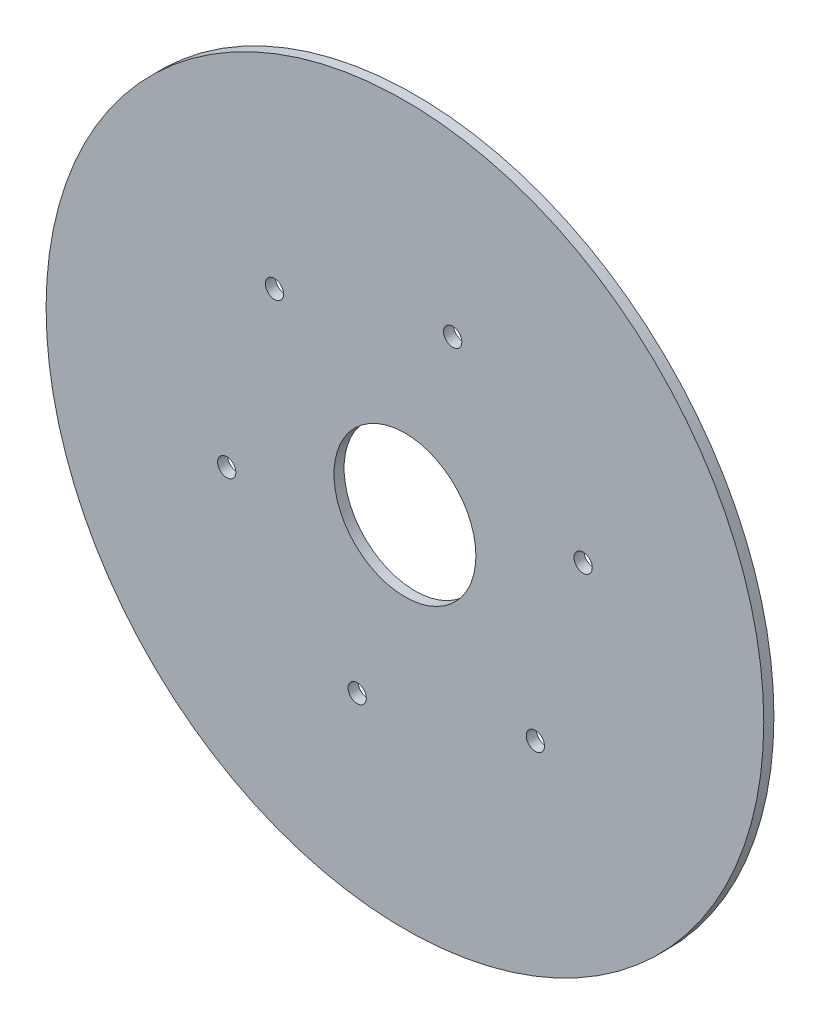
ISO-10303-21;
HEADER;
FILE_DESCRIPTION(('STEP AP214'),'2;1');
FILE_NAME('part.step','',(''),(''),'','','');
FILE_SCHEMA(('AUTOMOTIVE_DESIGN { 1 0 10303 214 1 1 1 1 }'));
ENDSEC;
DATA;
#1=APPLICATION_CONTEXT('core data for automotive mechanical design processes');
#2=APPLICATION_PROTOCOL_DEFINITION('international standard','automotive_design',2000,#1);
#3=PRODUCT_CONTEXT('',#1,'mechanical');
#4=PRODUCT('Part','Part','',(#3));
#5=PRODUCT_RELATED_PRODUCT_CATEGORY('part','',(#4));
#6=PRODUCT_DEFINITION_FORMATION('','',#4);
#7=PRODUCT_DEFINITION_CONTEXT('part definition',#1,'design');
#8=PRODUCT_DEFINITION('design','',#6,#7);
#9=PRODUCT_DEFINITION_SHAPE('','',#8);
#10=(LENGTH_UNIT() NAMED_UNIT(*) SI_UNIT(.MILLI.,.METRE.));
#11=(NAMED_UNIT(*) PLANE_ANGLE_UNIT() SI_UNIT($,.RADIAN.));
#12=(NAMED_UNIT(*) SI_UNIT($,.STERADIAN.) SOLID_ANGLE_UNIT());
#13=UNCERTAINTY_MEASURE_WITH_UNIT(LENGTH_MEASURE(1.E-05),#10,'distance_accuracy_value','');
#14=(GEOMETRIC_REPRESENTATION_CONTEXT(3) GLOBAL_UNCERTAINTY_ASSIGNED_CONTEXT((#13)) GLOBAL_UNIT_ASSIGNED_CONTEXT((#10,
#11,#12)) REPRESENTATION_CONTEXT('',''));
#15=CARTESIAN_POINT('',(0.,0.,0.));
#16=DIRECTION('',(0.,0.,1.));
#17=DIRECTION('',(1.,0.,0.));
#18=AXIS2_PLACEMENT_3D('',#15,#16,#17);
#19=CARTESIAN_POINT('',(0.,0.,50.));
#20=DIRECTION('',(0.,0.,1.));
#21=DIRECTION('',(1.,0.,0.));
#22=AXIS2_PLACEMENT_3D('',#19,#20,#21);
#23=PLANE('',#22);
#24=CARTESIAN_POINT('',(43.9496250961526,11.7762665521647,50.));
#25=DIRECTION('',(0.,0.,1.));
#26=DIRECTION('',(1.,0.,0.));
#27=AXIS2_PLACEMENT_3D('',#24,#25,#26);
#28=CIRCLE('',#27,2.25);
#29=CARTESIAN_POINT('',(46.1996250961526,11.7762665521647,50.));
#30=VERTEX_POINT('',#29);
#31=EDGE_CURVE('E94',#30,#30,#28,.T.);
#32=ORIENTED_EDGE('',*,*,#31,.F.);
#33=EDGE_LOOP('',(#32));
#34=FACE_BOUND('',#33,.T.);
#35=CARTESIAN_POINT('',(11.7762665521647,43.9496250961526,50.));
#36=DIRECTION('',(0.,0.,1.));
#37=DIRECTION('',(1.,0.,0.));
#38=AXIS2_PLACEMENT_3D('',#35,#36,#37);
#39=CIRCLE('',#38,2.25);
#40=CARTESIAN_POINT('',(14.0262665521647,43.9496250961526,50.));
#41=VERTEX_POINT('',#40);
#42=EDGE_CURVE('E80',#41,#41,#39,.T.);
#43=ORIENTED_EDGE('',*,*,#42,.F.);
#44=EDGE_LOOP('',(#43));
#45=FACE_BOUND('',#44,.T.);
#46=CARTESIAN_POINT('',(-32.1733585439879,32.1733585439879,50.));
#47=DIRECTION('',(0.,0.,1.));
#48=DIRECTION('',(1.,0.,0.));
#49=AXIS2_PLACEMENT_3D('',#46,#47,#48);
#50=CIRCLE('',#49,2.25);
#51=CARTESIAN_POINT('',(-29.9233585439879,32.1733585439879,50.));
#52=VERTEX_POINT('',#51);
#53=EDGE_CURVE('E76',#52,#52,#50,.T.);
#54=ORIENTED_EDGE('',*,*,#53,.F.);
#55=EDGE_LOOP('',(#54));
#56=FACE_BOUND('',#55,.T.);
#57=CARTESIAN_POINT('',(-43.9496250961526,-11.7762665521647,50.));
#58=DIRECTION('',(0.,0.,1.));
#59=DIRECTION('',(1.,0.,0.));
#60=AXIS2_PLACEMENT_3D('',#57,#58,#59);
#61=CIRCLE('',#60,2.25);
#62=CARTESIAN_POINT('',(-41.6996250961526,-11.7762665521647,50.));
#63=VERTEX_POINT('',#62);
#64=EDGE_CURVE('E73',#63,#63,#61,.T.);
#65=ORIENTED_EDGE('',*,*,#64,.F.);
#66=EDGE_LOOP('',(#65));
#67=FACE_BOUND('',#66,.T.);
#68=CARTESIAN_POINT('',(-11.7762665521647,-43.9496250961526,50.));
#69=DIRECTION('',(0.,0.,1.));
#70=DIRECTION('',(1.,0.,0.));
#71=AXIS2_PLACEMENT_3D('',#68,#69,#70);
#72=CIRCLE('',#71,2.25);
#73=CARTESIAN_POINT('',(-9.52626655216473,-43.9496250961526,50.));
#74=VERTEX_POINT('',#73);
#75=EDGE_CURVE('E68',#74,#74,#72,.T.);
#76=ORIENTED_EDGE('',*,*,#75,.F.);
#77=EDGE_LOOP('',(#76));
#78=FACE_BOUND('',#77,.T.);
#79=CARTESIAN_POINT('',(32.1733585439879,-32.1733585439879,50.));
#80=DIRECTION('',(0.,0.,1.));
#81=DIRECTION('',(1.,0.,0.));
#82=AXIS2_PLACEMENT_3D('',#79,#80,#81);
#83=CIRCLE('',#82,2.25);
#84=CARTESIAN_POINT('',(34.4233585439879,-32.1733585439879,50.));
#85=VERTEX_POINT('',#84);
#86=EDGE_CURVE('E63',#85,#85,#83,.T.);
#87=ORIENTED_EDGE('',*,*,#86,.F.);
#88=EDGE_LOOP('',(#87));
#89=FACE_BOUND('',#88,.T.);
#90=CARTESIAN_POINT('',(0.,0.,50.));
#91=DIRECTION('',(0.,0.,1.));
#92=DIRECTION('',(1.,0.,0.));
#93=AXIS2_PLACEMENT_3D('',#90,#91,#92);
#94=CIRCLE('',#93,88.5);
#95=CARTESIAN_POINT('',(88.5,0.,50.));
#96=VERTEX_POINT('',#95);
#97=EDGE_CURVE('E10',#96,#96,#94,.T.);
#98=ORIENTED_EDGE('',*,*,#97,.T.);
#99=EDGE_LOOP('',(#98));
#100=FACE_BOUND('',#99,.T.);
#101=CARTESIAN_POINT('',(0.,0.,50.));
#102=DIRECTION('',(0.,0.,1.));
#103=DIRECTION('',(1.,0.,0.));
#104=AXIS2_PLACEMENT_3D('',#101,#102,#103);
#105=CIRCLE('',#104,17.5);
#106=CARTESIAN_POINT('',(17.5,0.,50.));
#107=VERTEX_POINT('',#106);
#108=EDGE_CURVE('E53',#107,#107,#105,.T.);
#109=ORIENTED_EDGE('',*,*,#108,.F.);
#110=EDGE_LOOP('',(#109));
#111=FACE_BOUND('',#110,.T.);
#112=ADVANCED_FACE('F36',(#34,#45,#56,#67,#78,#89,#100,#111),#23,.T.);
#113=CARTESIAN_POINT('',(0.,0.,47.5));
#114=DIRECTION('',(0.,0.,1.));
#115=DIRECTION('',(1.,0.,0.));
#116=AXIS2_PLACEMENT_3D('',#113,#114,#115);
#117=PLANE('',#116);
#118=CARTESIAN_POINT('',(43.9496250961526,11.7762665521647,47.5));
#119=DIRECTION('',(0.,0.,1.));
#120=DIRECTION('',(1.,0.,0.));
#121=AXIS2_PLACEMENT_3D('',#118,#119,#120);
#122=CIRCLE('',#121,2.25);
#123=CARTESIAN_POINT('',(46.1996250961526,11.7762665521647,47.5));
#124=VERTEX_POINT('',#123);
#125=EDGE_CURVE('E40',#124,#124,#122,.T.);
#126=ORIENTED_EDGE('',*,*,#125,.T.);
#127=EDGE_LOOP('',(#126));
#128=FACE_BOUND('',#127,.T.);
#129=CARTESIAN_POINT('',(11.7762665521647,43.9496250961526,47.5));
#130=DIRECTION('',(0.,0.,1.));
#131=DIRECTION('',(1.,0.,0.));
#132=AXIS2_PLACEMENT_3D('',#129,#130,#131);
#133=CIRCLE('',#132,2.25);
#134=CARTESIAN_POINT('',(14.0262665521647,43.9496250961526,47.5));
#135=VERTEX_POINT('',#134);
#136=EDGE_CURVE('E77',#135,#135,#133,.T.);
#137=ORIENTED_EDGE('',*,*,#136,.T.);
#138=EDGE_LOOP('',(#137));
#139=FACE_BOUND('',#138,.T.);
#140=CARTESIAN_POINT('',(-32.1733585439879,32.1733585439879,47.5));
#141=DIRECTION('',(0.,0.,1.));
#142=DIRECTION('',(1.,0.,0.));
#143=AXIS2_PLACEMENT_3D('',#140,#141,#142);
#144=CIRCLE('',#143,2.25);
#145=CARTESIAN_POINT('',(-29.9233585439879,32.1733585439879,47.5));
#146=VERTEX_POINT('',#145);
#147=EDGE_CURVE('E74',#146,#146,#144,.T.);
#148=ORIENTED_EDGE('',*,*,#147,.T.);
#149=EDGE_LOOP('',(#148));
#150=FACE_BOUND('',#149,.T.);
#151=CARTESIAN_POINT('',(-43.9496250961526,-11.7762665521647,47.5));
#152=DIRECTION('',(0.,0.,1.));
#153=DIRECTION('',(1.,0.,0.));
#154=AXIS2_PLACEMENT_3D('',#151,#152,#153);
#155=CIRCLE('',#154,2.25);
#156=CARTESIAN_POINT('',(-41.6996250961526,-11.7762665521647,47.5));
#157=VERTEX_POINT('',#156);
#158=EDGE_CURVE('E69',#157,#157,#155,.T.);
#159=ORIENTED_EDGE('',*,*,#158,.T.);
#160=EDGE_LOOP('',(#159));
#161=FACE_BOUND('',#160,.T.);
#162=CARTESIAN_POINT('',(-11.7762665521647,-43.9496250961526,47.5));
#163=DIRECTION('',(0.,0.,1.));
#164=DIRECTION('',(1.,0.,0.));
#165=AXIS2_PLACEMENT_3D('',#162,#163,#164);
#166=CIRCLE('',#165,2.25);
#167=CARTESIAN_POINT('',(-9.52626655216473,-43.9496250961526,47.5));
#168=VERTEX_POINT('',#167);
#169=EDGE_CURVE('E64',#168,#168,#166,.T.);
#170=ORIENTED_EDGE('',*,*,#169,.T.);
#171=EDGE_LOOP('',(#170));
#172=FACE_BOUND('',#171,.T.);
#173=CARTESIAN_POINT('',(32.1733585439879,-32.1733585439879,47.5));
#174=DIRECTION('',(0.,0.,1.));
#175=DIRECTION('',(1.,0.,0.));
#176=AXIS2_PLACEMENT_3D('',#173,#174,#175);
#177=CIRCLE('',#176,2.25);
#178=CARTESIAN_POINT('',(34.4233585439879,-32.1733585439879,47.5));
#179=VERTEX_POINT('',#178);
#180=EDGE_CURVE('E59',#179,#179,#177,.T.);
#181=ORIENTED_EDGE('',*,*,#180,.T.);
#182=EDGE_LOOP('',(#181));
#183=FACE_BOUND('',#182,.T.);
#184=CARTESIAN_POINT('',(0.,0.,47.5));
#185=DIRECTION('',(0.,0.,1.));
#186=DIRECTION('',(1.,0.,0.));
#187=AXIS2_PLACEMENT_3D('',#184,#185,#186);
#188=CIRCLE('',#187,88.5);
#189=CARTESIAN_POINT('',(88.5,0.,47.5));
#190=VERTEX_POINT('',#189);
#191=EDGE_CURVE('E45',#190,#190,#188,.T.);
#192=ORIENTED_EDGE('',*,*,#191,.F.);
#193=EDGE_LOOP('',(#192));
#194=FACE_BOUND('',#193,.T.);
#195=CARTESIAN_POINT('',(0.,0.,47.5));
#196=DIRECTION('',(0.,0.,1.));
#197=DIRECTION('',(1.,0.,0.));
#198=AXIS2_PLACEMENT_3D('',#195,#196,#197);
#199=CIRCLE('',#198,17.5);
#200=CARTESIAN_POINT('',(17.5,0.,47.5));
#201=VERTEX_POINT('',#200);
#202=EDGE_CURVE('E56',#201,#201,#199,.T.);
#203=ORIENTED_EDGE('',*,*,#202,.T.);
#204=EDGE_LOOP('',(#203));
#205=FACE_BOUND('',#204,.T.);
#206=ADVANCED_FACE('F105',(#128,#139,#150,#161,#172,#183,#194,#205),#117,.F.);
#207=CARTESIAN_POINT('',(0.,0.,50.));
#208=DIRECTION('',(0.,0.,-1.));
#209=DIRECTION('',(-1.,0.,0.));
#210=AXIS2_PLACEMENT_3D('',#207,#208,#209);
#211=CYLINDRICAL_SURFACE('',#210,88.5);
#212=ORIENTED_EDGE('',*,*,#97,.F.);
#213=EDGE_LOOP('',(#212));
#214=FACE_BOUND('',#213,.T.);
#215=ORIENTED_EDGE('',*,*,#191,.T.);
#216=EDGE_LOOP('',(#215));
#217=FACE_BOUND('',#216,.T.);
#218=ADVANCED_FACE('F38',(#214,#217),#211,.T.);
#219=CARTESIAN_POINT('',(0.,0.,50.));
#220=DIRECTION('',(0.,0.,-1.));
#221=DIRECTION('',(-1.,0.,0.));
#222=AXIS2_PLACEMENT_3D('',#219,#220,#221);
#223=CYLINDRICAL_SURFACE('',#222,17.5);
#224=ORIENTED_EDGE('',*,*,#108,.T.);
#225=EDGE_LOOP('',(#224));
#226=FACE_BOUND('',#225,.T.);
#227=ORIENTED_EDGE('',*,*,#202,.F.);
#228=EDGE_LOOP('',(#227));
#229=FACE_BOUND('',#228,.T.);
#230=ADVANCED_FACE('F107',(#226,#229),#223,.F.);
#231=CARTESIAN_POINT('',(32.1733585439879,-32.1733585439879,-100.));
#232=DIRECTION('',(0.,0.,1.));
#233=DIRECTION('',(1.,0.,0.));
#234=AXIS2_PLACEMENT_3D('',#231,#232,#233);
#235=CYLINDRICAL_SURFACE('',#234,2.25);
#236=ORIENTED_EDGE('',*,*,#86,.T.);
#237=EDGE_LOOP('',(#236));
#238=FACE_BOUND('',#237,.T.);
#239=ORIENTED_EDGE('',*,*,#180,.F.);
#240=EDGE_LOOP('',(#239));
#241=FACE_BOUND('',#240,.T.);
#242=ADVANCED_FACE('F109',(#238,#241),#235,.F.);
#243=CARTESIAN_POINT('',(-11.7762665521647,-43.9496250961526,-100.));
#244=DIRECTION('',(0.,0.,1.));
#245=DIRECTION('',(1.,0.,0.));
#246=AXIS2_PLACEMENT_3D('',#243,#244,#245);
#247=CYLINDRICAL_SURFACE('',#246,2.25);
#248=ORIENTED_EDGE('',*,*,#75,.T.);
#249=EDGE_LOOP('',(#248));
#250=FACE_BOUND('',#249,.T.);
#251=ORIENTED_EDGE('',*,*,#169,.F.);
#252=EDGE_LOOP('',(#251));
#253=FACE_BOUND('',#252,.T.);
#254=ADVANCED_FACE('F115',(#250,#253),#247,.F.);
#255=CARTESIAN_POINT('',(-43.9496250961526,-11.7762665521647,-100.));
#256=DIRECTION('',(0.,0.,1.));
#257=DIRECTION('',(1.,0.,0.));
#258=AXIS2_PLACEMENT_3D('',#255,#256,#257);
#259=CYLINDRICAL_SURFACE('',#258,2.25);
#260=ORIENTED_EDGE('',*,*,#64,.T.);
#261=EDGE_LOOP('',(#260));
#262=FACE_BOUND('',#261,.T.);
#263=ORIENTED_EDGE('',*,*,#158,.F.);
#264=EDGE_LOOP('',(#263));
#265=FACE_BOUND('',#264,.T.);
#266=ADVANCED_FACE('F147',(#262,#265),#259,.F.);
#267=CARTESIAN_POINT('',(-32.1733585439879,32.1733585439879,-100.));
#268=DIRECTION('',(0.,0.,1.));
#269=DIRECTION('',(1.,0.,0.));
#270=AXIS2_PLACEMENT_3D('',#267,#268,#269);
#271=CYLINDRICAL_SURFACE('',#270,2.25);
#272=ORIENTED_EDGE('',*,*,#53,.T.);
#273=EDGE_LOOP('',(#272));
#274=FACE_BOUND('',#273,.T.);
#275=ORIENTED_EDGE('',*,*,#147,.F.);
#276=EDGE_LOOP('',(#275));
#277=FACE_BOUND('',#276,.T.);
#278=ADVANCED_FACE('F160',(#274,#277),#271,.F.);
#279=CARTESIAN_POINT('',(11.7762665521647,43.9496250961526,-100.));
#280=DIRECTION('',(0.,0.,1.));
#281=DIRECTION('',(1.,0.,0.));
#282=AXIS2_PLACEMENT_3D('',#279,#280,#281);
#283=CYLINDRICAL_SURFACE('',#282,2.25);
#284=ORIENTED_EDGE('',*,*,#42,.T.);
#285=EDGE_LOOP('',(#284));
#286=FACE_BOUND('',#285,.T.);
#287=ORIENTED_EDGE('',*,*,#136,.F.);
#288=EDGE_LOOP('',(#287));
#289=FACE_BOUND('',#288,.T.);
#290=ADVANCED_FACE('F166',(#286,#289),#283,.F.);
#291=CARTESIAN_POINT('',(43.9496250961526,11.7762665521647,-100.));
#292=DIRECTION('',(0.,0.,1.));
#293=DIRECTION('',(1.,0.,0.));
#294=AXIS2_PLACEMENT_3D('',#291,#292,#293);
#295=CYLINDRICAL_SURFACE('',#294,2.25);
#296=ORIENTED_EDGE('',*,*,#31,.T.);
#297=EDGE_LOOP('',(#296));
#298=FACE_BOUND('',#297,.T.);
#299=ORIENTED_EDGE('',*,*,#125,.F.);
#300=EDGE_LOOP('',(#299));
#301=FACE_BOUND('',#300,.T.);
#302=ADVANCED_FACE('F169',(#298,#301),#295,.F.);
#303=CLOSED_SHELL('',(#112,#206,#218,#230,#242,#254,#266,#278,#290,#302));
#304=MANIFOLD_SOLID_BREP('B2',#303);
#305=ADVANCED_BREP_SHAPE_REPRESENTATION('',(#18,#304),#14);
#306=SHAPE_DEFINITION_REPRESENTATION(#9,#305);
ENDSEC;
END-ISO-10303-21;
